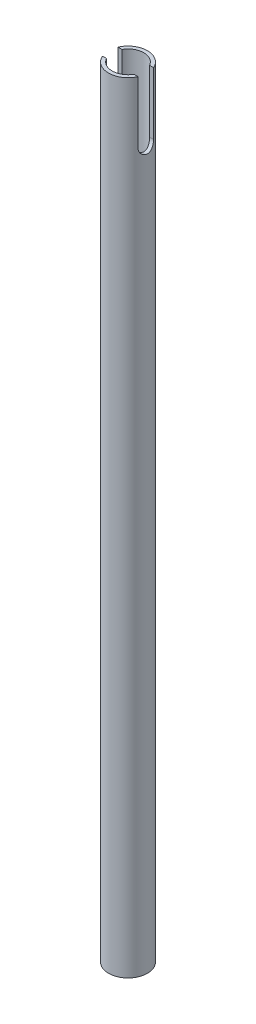
ISO-10303-21;
HEADER;
FILE_DESCRIPTION(('STEP AP214'),'2;1');
FILE_NAME('part.step','',(''),(''),'','','');
FILE_SCHEMA(('AUTOMOTIVE_DESIGN { 1 0 10303 214 1 1 1 1 }'));
ENDSEC;
DATA;
#1=APPLICATION_CONTEXT('core data for automotive mechanical design processes');
#2=APPLICATION_PROTOCOL_DEFINITION('international standard','automotive_design',2000,#1);
#3=PRODUCT_CONTEXT('',#1,'mechanical');
#4=PRODUCT('Part','Part','',(#3));
#5=PRODUCT_RELATED_PRODUCT_CATEGORY('part','',(#4));
#6=PRODUCT_DEFINITION_FORMATION('','',#4);
#7=PRODUCT_DEFINITION_CONTEXT('part definition',#1,'design');
#8=PRODUCT_DEFINITION('design','',#6,#7);
#9=PRODUCT_DEFINITION_SHAPE('','',#8);
#10=(LENGTH_UNIT() NAMED_UNIT(*) SI_UNIT(.MILLI.,.METRE.));
#11=(NAMED_UNIT(*) PLANE_ANGLE_UNIT() SI_UNIT($,.RADIAN.));
#12=(NAMED_UNIT(*) SI_UNIT($,.STERADIAN.) SOLID_ANGLE_UNIT());
#13=UNCERTAINTY_MEASURE_WITH_UNIT(LENGTH_MEASURE(1.E-05),#10,'distance_accuracy_value','');
#14=(GEOMETRIC_REPRESENTATION_CONTEXT(3) GLOBAL_UNCERTAINTY_ASSIGNED_CONTEXT((#13)) GLOBAL_UNIT_ASSIGNED_CONTEXT((#10,
#11,#12)) REPRESENTATION_CONTEXT('',''));
#15=CARTESIAN_POINT('',(0.,0.,0.));
#16=DIRECTION('',(0.,0.,1.));
#17=DIRECTION('',(1.,0.,0.));
#18=AXIS2_PLACEMENT_3D('',#15,#16,#17);
#19=CARTESIAN_POINT('',(0.,318.547702052848,3.17500000000002));
#20=DIRECTION('',(0.,1.,0.));
#21=DIRECTION('',(-1.,0.,0.));
#22=AXIS2_PLACEMENT_3D('',#19,#20,#21);
#23=PLANE('',#22);
#24=DIRECTION('',(-1.,0.,0.));
#25=VECTOR('',#24,1.);
#26=CARTESIAN_POINT('',(0.,318.547702052848,-3.17500000000001));
#27=LINE('',#26,#25);
#28=CARTESIAN_POINT('',(7.27483891574239,318.547702052848,-3.17500000000001));
#29=VERTEX_POINT('',#28);
#30=CARTESIAN_POINT('',(5.63085690548072,318.547702052848,-3.17500000000001));
#31=VERTEX_POINT('',#30);
#32=EDGE_CURVE('E178',#29,#31,#27,.T.);
#33=ORIENTED_EDGE('',*,*,#32,.F.);
#34=CARTESIAN_POINT('',(0.,318.547702052848,0.));
#35=DIRECTION('',(0.,1.,0.));
#36=DIRECTION('',(-1.,0.,0.));
#37=AXIS2_PLACEMENT_3D('',#34,#35,#36);
#38=CIRCLE('',#37,7.9375);
#39=CARTESIAN_POINT('',(-7.27483891574239,318.547702052848,-3.17500000000001));
#40=VERTEX_POINT('',#39);
#41=EDGE_CURVE('E219',#29,#40,#38,.T.);
#42=ORIENTED_EDGE('',*,*,#41,.T.);
#43=CARTESIAN_POINT('',(-5.63085690548072,318.547702052848,-3.17500000000001));
#44=VERTEX_POINT('',#43);
#45=EDGE_CURVE('E179',#44,#40,#27,.T.);
#46=ORIENTED_EDGE('',*,*,#45,.F.);
#47=CARTESIAN_POINT('',(0.,318.547702052848,0.));
#48=DIRECTION('',(0.,1.,0.));
#49=DIRECTION('',(-1.,0.,0.));
#50=AXIS2_PLACEMENT_3D('',#47,#48,#49);
#51=CIRCLE('',#50,6.4643);
#52=EDGE_CURVE('E215',#31,#44,#51,.T.);
#53=ORIENTED_EDGE('',*,*,#52,.F.);
#54=EDGE_LOOP('',(#33,#42,#46,#53));
#55=FACE_BOUND('',#54,.T.);
#56=ADVANCED_FACE('F44',(#55),#23,.T.);
#57=CARTESIAN_POINT('',(0.,366.39834235552,0.));
#58=DIRECTION('',(0.,-1.,0.));
#59=DIRECTION('',(0.,0.,-1.));
#60=AXIS2_PLACEMENT_3D('',#57,#58,#59);
#61=CYLINDRICAL_SURFACE('',#60,7.9375);
#62=CARTESIAN_POINT('',(0.,0.,0.));
#63=DIRECTION('',(0.,1.,0.));
#64=DIRECTION('',(0.,0.,1.));
#65=AXIS2_PLACEMENT_3D('',#62,#63,#64);
#66=CIRCLE('',#65,7.9375);
#67=CARTESIAN_POINT('',(0.,0.,7.9375));
#68=VERTEX_POINT('',#67);
#69=EDGE_CURVE('E216',#68,#68,#66,.T.);
#70=ORIENTED_EDGE('',*,*,#69,.T.);
#71=EDGE_LOOP('',(#70));
#72=FACE_BOUND('',#71,.T.);
#73=ORIENTED_EDGE('',*,*,#41,.F.);
#74=DIRECTION('',(0.,-1.,0.));
#75=VECTOR('',#74,1.);
#76=CARTESIAN_POINT('',(7.2748389157424,366.39834235552,-3.175));
#77=LINE('',#76,#75);
#78=CARTESIAN_POINT('',(7.27483891574239,293.147702052848,-3.17500000000001));
#79=VERTEX_POINT('',#78);
#80=EDGE_CURVE('E127',#29,#79,#77,.T.);
#81=ORIENTED_EDGE('',*,*,#80,.T.);
#82=CARTESIAN_POINT('',(7.27483891574239,293.147702052848,-3.17500000000001));
#83=CARTESIAN_POINT('',(7.2748213734673,293.062285262,-3.17501266882702));
#84=CARTESIAN_POINT('',(7.27634285897749,292.976878058775,-3.17155340043565));
#85=CARTESIAN_POINT('',(7.2823328035035,292.806752616868,-3.15779000732847));
#86=CARTESIAN_POINT('',(7.28680014012065,292.72203412822,-3.14748848956709));
#87=CARTESIAN_POINT('',(7.29852780386515,292.554220223623,-3.12019320836237));
#88=CARTESIAN_POINT('',(7.30577708764083,292.471119738178,-3.10322589952438));
#89=CARTESIAN_POINT('',(7.32282084608483,292.306802077751,-3.06278962927674));
#90=CARTESIAN_POINT('',(7.3326154761132,292.225585018058,-3.03932027099634));
#91=CARTESIAN_POINT('',(7.36535374856868,291.985753890049,-2.95952817722213));
#92=CARTESIAN_POINT('',(7.39167700537415,291.830625961629,-2.89376627017734));
#93=CARTESIAN_POINT('',(7.45033388590046,291.533539069465,-2.73920254152609));
#94=CARTESIAN_POINT('',(7.48267321509131,291.391592800016,-2.65037881684982));
#95=CARTESIAN_POINT('',(7.55175336550834,291.116872998133,-2.4468428923214));
#96=CARTESIAN_POINT('',(7.588634899463,290.984944096008,-2.33103600963009));
#97=CARTESIAN_POINT('',(7.66147804996073,290.741781870692,-2.07914313305181));
#98=CARTESIAN_POINT('',(7.69743947634238,290.630552796269,-1.94305298619927));
#99=CARTESIAN_POINT('',(7.76610424655586,290.427669402144,-1.64783437907488));
#100=CARTESIAN_POINT('',(7.79862271461643,290.336962168457,-1.4880080936519));
#101=CARTESIAN_POINT('',(7.85501261299655,290.184087087141,-1.15383332747061));
#102=CARTESIAN_POINT('',(7.87888765130921,290.121907328496,-0.979490943577491));
#103=CARTESIAN_POINT('',(7.91429574508624,290.03089789688,-0.630185812820631));
#104=CARTESIAN_POINT('',(7.92637039529115,290.000599272346,-0.455661798193253));
#105=CARTESIAN_POINT('',(7.93877492459936,289.969481836874,-0.103613634211554));
#106=CARTESIAN_POINT('',(7.93910896442721,289.968652582362,0.0739094300030662));
#107=CARTESIAN_POINT('',(7.92832361516669,289.995693574287,0.416295487790184));
#108=CARTESIAN_POINT('',(7.91784651916131,290.021954366317,0.581309494992125));
#109=CARTESIAN_POINT('',(7.88748217026596,290.099691566418,0.904358712556958));
#110=CARTESIAN_POINT('',(7.86759438481231,290.151169401561,1.06239352740443));
#111=CARTESIAN_POINT('',(7.81997467816328,290.278512369575,1.36984988491621));
#112=CARTESIAN_POINT('',(7.7921290207194,290.354733459711,1.51910565802053));
#113=CARTESIAN_POINT('',(7.7313568354174,290.529063849907,1.80309420082014));
#114=CARTESIAN_POINT('',(7.69842852631223,290.627180828913,1.93782185081832));
#115=CARTESIAN_POINT('',(7.62828318752464,290.85002762316,2.19831250886755));
#116=CARTESIAN_POINT('',(7.59092651959626,290.976080765635,2.32290812422053));
#117=CARTESIAN_POINT('',(7.51779639956165,291.247421664227,2.54968017957911));
#118=CARTESIAN_POINT('',(7.48202367463434,291.392718135143,2.6518464058569));
#119=CARTESIAN_POINT('',(7.41514238501918,291.703867074882,2.83359604410576));
#120=CARTESIAN_POINT('',(7.38419755733312,291.870190566346,2.91244544007289));
#121=CARTESIAN_POINT('',(7.34535742834899,292.128731439733,3.00845526999253));
#122=CARTESIAN_POINT('',(7.3336755200429,292.216398247957,3.03674359852996));
#123=CARTESIAN_POINT('',(7.31322917691504,292.394163962671,3.08565852812915));
#124=CARTESIAN_POINT('',(7.30446343423192,292.484261759241,3.10628856431505));
#125=CARTESIAN_POINT('',(7.28994070197193,292.669426211279,3.14023004946565));
#126=CARTESIAN_POINT('',(7.2843027635288,292.764555236803,3.15325280299648));
#127=CARTESIAN_POINT('',(7.27673901487912,292.955685811395,3.17064531592314));
#128=CARTESIAN_POINT('',(7.2748109173123,293.051686786135,3.17502040721544));
#129=CARTESIAN_POINT('',(7.2748389157424,293.147702052848,3.175));
#130=B_SPLINE_CURVE_WITH_KNOTS('',3,(#82,#83,#84,#85,#86,#87,#88,#89,#90,#91,#92,#93,#94,#95,
#96,#97,#98,#99,#100,#101,#102,#103,#104,#105,#106,#107,#108,#109,#110,#111,#112,#113,#114,#115,
#116,#117,#118,#119,#120,#121,#122,#123,#124,#125,#126,#127,#128,#129),.UNSPECIFIED.,.F.,.F.,(4,
2,2,2,2,2,2,2,2,2,2,2,2,2,2,2,2,2,2,2,2,2,2,4),(0.,0.256150829294331,0.512204118914609,
0.767251309112382,1.02231407025902,1.53143426526081,2.04103977971416,2.57679901192851,
3.11266809105968,3.66971038544651,4.22651988700747,4.75637028950526,5.28603291779513,
5.78594402974509,6.28588343572724,6.79335980872476,7.30101443548667,7.84196226045961,
8.38315590960401,8.93991483457334,9.2181569720588,9.49627415290112,9.78435582473147,
10.072259818324),.UNSPECIFIED.);
#131=CARTESIAN_POINT('',(7.27483891574239,293.147702052848,3.175));
#132=VERTEX_POINT('',#131);
#133=EDGE_CURVE('E126',#79,#132,#130,.T.);
#134=ORIENTED_EDGE('',*,*,#133,.T.);
#135=DIRECTION('',(0.,-1.,0.));
#136=VECTOR('',#135,1.);
#137=CARTESIAN_POINT('',(7.27483891574239,366.39834235552,3.17500000000001));
#138=LINE('',#137,#136);
#139=CARTESIAN_POINT('',(7.27483891574238,318.547702052848,3.17500000000003));
#140=VERTEX_POINT('',#139);
#141=EDGE_CURVE('E144',#132,#140,#138,.F.);
#142=ORIENTED_EDGE('',*,*,#141,.T.);
#143=CARTESIAN_POINT('',(-7.27483891574238,318.547702052848,3.17500000000003));
#144=VERTEX_POINT('',#143);
#145=EDGE_CURVE('E139',#144,#140,#38,.T.);
#146=ORIENTED_EDGE('',*,*,#145,.F.);
#147=DIRECTION('',(0.,-1.,0.));
#148=VECTOR('',#147,1.);
#149=CARTESIAN_POINT('',(-7.27483891574239,366.39834235552,3.17500000000001));
#150=LINE('',#149,#148);
#151=CARTESIAN_POINT('',(-7.27483891574239,293.147702052848,3.175));
#152=VERTEX_POINT('',#151);
#153=EDGE_CURVE('E66',#144,#152,#150,.T.);
#154=ORIENTED_EDGE('',*,*,#153,.T.);
#155=CARTESIAN_POINT('',(-7.2748389157424,293.147702052848,3.175));
#156=CARTESIAN_POINT('',(-7.2748213734673,293.062285262,3.17501266882701));
#157=CARTESIAN_POINT('',(-7.2763428589775,292.976878058775,3.17155340043565));
#158=CARTESIAN_POINT('',(-7.2823328035035,292.806752616868,3.15779000732847));
#159=CARTESIAN_POINT('',(-7.28680014012065,292.72203412822,3.14748848956708));
#160=CARTESIAN_POINT('',(-7.29852780386515,292.554220223623,3.12019320836236));
#161=CARTESIAN_POINT('',(-7.30577708764083,292.471119738178,3.10322589952438));
#162=CARTESIAN_POINT('',(-7.32282084608483,292.306802077751,3.06278962927674));
#163=CARTESIAN_POINT('',(-7.3326154761132,292.225585018058,3.03932027099634));
#164=CARTESIAN_POINT('',(-7.36535374856868,291.985753890049,2.95952817722212));
#165=CARTESIAN_POINT('',(-7.39167700537416,291.830625961629,2.89376627017733));
#166=CARTESIAN_POINT('',(-7.45033388590046,291.533539069465,2.73920254152609));
#167=CARTESIAN_POINT('',(-7.48267321509132,291.391592800016,2.65037881684981));
#168=CARTESIAN_POINT('',(-7.55175336550835,291.116872998133,2.44684289232139));
#169=CARTESIAN_POINT('',(-7.588634899463,290.984944096008,2.33103600963008));
#170=CARTESIAN_POINT('',(-7.66147804996073,290.741781870692,2.07914313305181));
#171=CARTESIAN_POINT('',(-7.69743947634239,290.630552796269,1.94305298619927));
#172=CARTESIAN_POINT('',(-7.76610424655587,290.427669402144,1.64783437907488));
#173=CARTESIAN_POINT('',(-7.79862271461643,290.336962168457,1.4880080936519));
#174=CARTESIAN_POINT('',(-7.85501261299655,290.184087087141,1.15383332747061));
#175=CARTESIAN_POINT('',(-7.87888765130921,290.121907328496,0.979490943577485));
#176=CARTESIAN_POINT('',(-7.91429574508624,290.03089789688,0.630185812820626));
#177=CARTESIAN_POINT('',(-7.92637039529115,290.000599272346,0.455661798193248));
#178=CARTESIAN_POINT('',(-7.93877492459936,289.969481836874,0.103613634211548));
#179=CARTESIAN_POINT('',(-7.93910896442721,289.968652582362,-0.0739094300030721));
#180=CARTESIAN_POINT('',(-7.92832361516669,289.995693574287,-0.41629548779019));
#181=CARTESIAN_POINT('',(-7.91784651916131,290.021954366317,-0.58130949499213));
#182=CARTESIAN_POINT('',(-7.88748217026596,290.099691566418,-0.904358712556966));
#183=CARTESIAN_POINT('',(-7.86759438481231,290.151169401561,-1.06239352740444));
#184=CARTESIAN_POINT('',(-7.81997467816327,290.278512369575,-1.36984988491622));
#185=CARTESIAN_POINT('',(-7.7921290207194,290.354733459711,-1.51910565802055));
#186=CARTESIAN_POINT('',(-7.73135683541739,290.529063849907,-1.80309420082014));
#187=CARTESIAN_POINT('',(-7.69842852631223,290.627180828913,-1.93782185081832));
#188=CARTESIAN_POINT('',(-7.62828318752464,290.85002762316,-2.19831250886755));
#189=CARTESIAN_POINT('',(-7.59092651959626,290.976080765635,-2.32290812422053));
#190=CARTESIAN_POINT('',(-7.51779639956165,291.247421664227,-2.54968017957911));
#191=CARTESIAN_POINT('',(-7.48202367463433,291.392718135143,-2.65184640585691));
#192=CARTESIAN_POINT('',(-7.41514238501918,291.703867074882,-2.83359604410578));
#193=CARTESIAN_POINT('',(-7.38419755733311,291.870190566346,-2.91244544007291));
#194=CARTESIAN_POINT('',(-7.34535742834898,292.128731439733,-3.00845526999255));
#195=CARTESIAN_POINT('',(-7.33367552004289,292.216398247957,-3.03674359852999));
#196=CARTESIAN_POINT('',(-7.31322917691504,292.394163962671,-3.08565852812916));
#197=CARTESIAN_POINT('',(-7.30446343423191,292.484261759241,-3.10628856431506));
#198=CARTESIAN_POINT('',(-7.28994070197192,292.669426211279,-3.14023004946565));
#199=CARTESIAN_POINT('',(-7.2843027635288,292.764555236803,-3.15325280299648));
#200=CARTESIAN_POINT('',(-7.27673901487912,292.955685811395,-3.17064531592315));
#201=CARTESIAN_POINT('',(-7.2748109173123,293.051686786135,-3.17502040721544));
#202=CARTESIAN_POINT('',(-7.27483891574239,293.147702052848,-3.17500000000001));
#203=B_SPLINE_CURVE_WITH_KNOTS('',3,(#155,#156,#157,#158,#159,#160,#161,#162,#163,#164,#165,
#166,#167,#168,#169,#170,#171,#172,#173,#174,#175,#176,#177,#178,#179,#180,#181,#182,#183,#184,
#185,#186,#187,#188,#189,#190,#191,#192,#193,#194,#195,#196,#197,#198,#199,#200,#201,#202),
.UNSPECIFIED.,.F.,.F.,(4,2,2,2,2,2,2,2,2,2,2,2,2,2,2,2,2,2,2,2,2,2,2,4),(0.,0.256150829294331,
0.512204118914609,0.767251309112382,1.02231407025902,1.53143426526081,2.04103977971416,
2.57679901192851,3.11266809105968,3.66971038544651,4.22651988700747,4.75637028950526,
5.28603291779513,5.78594402974509,6.28588343572724,6.7933598087248,7.30101443548665,
7.8419622604596,8.383155909604,8.93991483457339,9.21815697205885,9.49627415290111,
9.78435582473146,10.072259818324),.UNSPECIFIED.);
#204=CARTESIAN_POINT('',(-7.27483891574239,293.147702052848,-3.17500000000001));
#205=VERTEX_POINT('',#204);
#206=EDGE_CURVE('E117',#152,#205,#203,.T.);
#207=ORIENTED_EDGE('',*,*,#206,.T.);
#208=DIRECTION('',(0.,-1.,0.));
#209=VECTOR('',#208,1.);
#210=CARTESIAN_POINT('',(-7.2748389157424,366.39834235552,-3.175));
#211=LINE('',#210,#209);
#212=EDGE_CURVE('E142',#205,#40,#211,.F.);
#213=ORIENTED_EDGE('',*,*,#212,.T.);
#214=EDGE_LOOP('',(#73,#81,#134,#142,#146,#154,#207,#213));
#215=FACE_BOUND('',#214,.T.);
#216=ADVANCED_FACE('F46',(#72,#215),#61,.T.);
#217=CARTESIAN_POINT('',(0.,0.,0.));
#218=DIRECTION('',(0.,1.,0.));
#219=DIRECTION('',(0.,0.,1.));
#220=AXIS2_PLACEMENT_3D('',#217,#218,#219);
#221=PLANE('',#220);
#222=ORIENTED_EDGE('',*,*,#69,.F.);
#223=EDGE_LOOP('',(#222));
#224=FACE_BOUND('',#223,.T.);
#225=CARTESIAN_POINT('',(0.,0.,0.));
#226=DIRECTION('',(0.,1.,0.));
#227=DIRECTION('',(0.,0.,1.));
#228=AXIS2_PLACEMENT_3D('',#225,#226,#227);
#229=CIRCLE('',#228,6.4643);
#230=CARTESIAN_POINT('',(0.,0.,6.4643));
#231=VERTEX_POINT('',#230);
#232=EDGE_CURVE('E214',#231,#231,#229,.T.);
#233=ORIENTED_EDGE('',*,*,#232,.T.);
#234=EDGE_LOOP('',(#233));
#235=FACE_BOUND('',#234,.T.);
#236=ADVANCED_FACE('F185',(#224,#235),#221,.F.);
#237=CARTESIAN_POINT('',(0.,366.39834235552,0.));
#238=DIRECTION('',(0.,-1.,0.));
#239=DIRECTION('',(0.,0.,-1.));
#240=AXIS2_PLACEMENT_3D('',#237,#238,#239);
#241=CYLINDRICAL_SURFACE('',#240,6.4643);
#242=DIRECTION('',(0.,-1.,0.));
#243=VECTOR('',#242,1.);
#244=CARTESIAN_POINT('',(-5.63085690548073,366.39834235552,-3.175));
#245=LINE('',#244,#243);
#246=CARTESIAN_POINT('',(-5.63085690548072,293.147702052848,-3.17500000000001));
#247=VERTEX_POINT('',#246);
#248=EDGE_CURVE('E140',#247,#44,#245,.F.);
#249=ORIENTED_EDGE('',*,*,#248,.F.);
#250=CARTESIAN_POINT('',(-5.63085690548073,293.147702052848,3.175));
#251=CARTESIAN_POINT('',(-5.63083314427865,293.064328708216,3.17501475658537));
#252=CARTESIAN_POINT('',(-5.63270800290612,292.980968524125,3.17171650894932));
#253=CARTESIAN_POINT('',(-5.64007619078876,292.814970264005,3.15861005673362));
#254=CARTESIAN_POINT('',(-5.64556738634361,292.73233179127,3.14880569084843));
#255=CARTESIAN_POINT('',(-5.65994981136479,292.568828302249,3.12287502503968));
#256=CARTESIAN_POINT('',(-5.66882198481542,292.487955984627,3.10678414485081));
#257=CARTESIAN_POINT('',(-5.68964152520503,292.328091727843,3.06848950606601));
#258=CARTESIAN_POINT('',(-5.70158922758274,292.24909999482,3.04628508066559));
#259=CARTESIAN_POINT('',(-5.74141923049072,292.016035196588,2.97094683956398));
#260=CARTESIAN_POINT('',(-5.77333408209964,291.865395567206,2.9090108202004));
#261=CARTESIAN_POINT('',(-5.84425924105451,291.576540998147,2.76375069900003));
#262=CARTESIAN_POINT('',(-5.8832801090714,291.438345014753,2.68039468681891));
#263=CARTESIAN_POINT('',(-5.96775511660967,291.166404237279,2.48697633404428));
#264=CARTESIAN_POINT('',(-6.01347388807208,291.033867202745,2.37532770540396));
#265=CARTESIAN_POINT('',(-6.10404750316967,290.788492445533,2.13181920715592));
#266=CARTESIAN_POINT('',(-6.1489021156932,290.675659929335,1.99995401300493));
#267=CARTESIAN_POINT('',(-6.23617179606458,290.465726853052,1.70932187954953));
#268=CARTESIAN_POINT('',(-6.27824209999684,290.370113386051,1.5493674014036));
#269=CARTESIAN_POINT('',(-6.35176072116115,290.207706153993,1.21319061658815));
#270=CARTESIAN_POINT('',(-6.38321544776103,290.140894992183,1.03697820811137));
#271=CARTESIAN_POINT('',(-6.43004158193837,290.0427689468,0.686188092188344));
#272=CARTESIAN_POINT('',(-6.4463738522475,290.009320961884,0.512338218857009));
#273=CARTESIAN_POINT('',(-6.46469144763397,289.97186037337,0.160782019690509));
#274=CARTESIAN_POINT('',(-6.46668486855406,289.967831159652,-0.0169220731568674));
#275=CARTESIAN_POINT('',(-6.45656772214049,289.98846695754,-0.355165464690635));
#276=CARTESIAN_POINT('',(-6.44562758639317,290.010750568325,-0.515892945153658));
#277=CARTESIAN_POINT('',(-6.41262380355029,290.079137374664,-0.830980900255625));
#278=CARTESIAN_POINT('',(-6.39055953953696,290.125241891273,-0.985341021262247));
#279=CARTESIAN_POINT('',(-6.33694807701977,290.240301134301,-1.28605792480315));
#280=CARTESIAN_POINT('',(-6.30527071175889,290.309570935335,-1.4322699933214));
#281=CARTESIAN_POINT('',(-6.23531544865734,290.468578121139,-1.71135796541494));
#282=CARTESIAN_POINT('',(-6.19703506227319,290.558323226762,-1.84422881097801));
#283=CARTESIAN_POINT('',(-6.11334024943196,290.765239123846,-2.10589815284403));
#284=CARTESIAN_POINT('',(-6.06759349912714,290.884173160067,-2.23319819913492));
#285=CARTESIAN_POINT('',(-5.97642079952692,291.141326671501,-2.46684622430581));
#286=CARTESIAN_POINT('',(-5.93099515323758,291.27956232274,-2.57317644688654));
#287=CARTESIAN_POINT('',(-5.84266284464015,291.581765150258,-2.76814528378424));
#288=CARTESIAN_POINT('',(-5.80007313328349,291.746781169311,-2.85533090866606));
#289=CARTESIAN_POINT('',(-5.74498523796176,292.005157987756,-2.96377401450739));
#290=CARTESIAN_POINT('',(-5.72809486991883,292.093046475715,-2.99618869442097));
#291=CARTESIAN_POINT('',(-5.69788122082071,292.271883162299,-3.05325494421091));
#292=CARTESIAN_POINT('',(-5.68455638707004,292.362830009603,-3.07790989407047));
#293=CARTESIAN_POINT('',(-5.65951648210793,292.567947445588,-3.12376274190012));
#294=CARTESIAN_POINT('',(-5.64884707083826,292.682718410884,-3.14291763203008));
#295=CARTESIAN_POINT('',(-5.63809564796982,292.856271517395,-3.16213513069619));
#296=CARTESIAN_POINT('',(-5.63538722073202,292.914411390762,-3.16695519983112));
#297=CARTESIAN_POINT('',(-5.63176603795252,293.030929021994,-3.17338827752118));
#298=CARTESIAN_POINT('',(-5.63085344341391,293.089306800718,-3.17500099852574));
#299=CARTESIAN_POINT('',(-5.63085690548073,293.147702052848,-3.17500000000001));
#300=B_SPLINE_CURVE_WITH_KNOTS('',3,(#250,#251,#252,#253,#254,#255,#256,#257,#258,#259,#260,
#261,#262,#263,#264,#265,#266,#267,#268,#269,#270,#271,#272,#273,#274,#275,#276,#277,#278,#279,
#280,#281,#282,#283,#284,#285,#286,#287,#288,#289,#290,#291,#292,#293,#294,#295,#296,#297,#298,
#299),.UNSPECIFIED.,.F.,.F.,(4,2,2,2,2,2,2,2,2,2,2,2,2,2,2,2,2,2,2,2,2,2,2,2,4),(0.,
0.250012145988229,0.499876912554615,0.748353725112907,0.996857649784888,1.4924278441344,
1.98874063593385,2.52414179614751,3.05968421079767,3.6298216154268,4.19961416973237,
4.73004882970632,5.26018397799674,5.74579693142526,6.23143681875925,6.72397049630929,
7.21669020692482,7.75472587709904,8.2932151937208,8.86416763704415,9.14936329782655,
9.43443456060703,9.78397951274086,9.95908597830924,10.1342081421097),.UNSPECIFIED.);
#301=CARTESIAN_POINT('',(-5.63085690548072,293.147702052848,3.175));
#302=VERTEX_POINT('',#301);
#303=EDGE_CURVE('E12',#302,#247,#300,.T.);
#304=ORIENTED_EDGE('',*,*,#303,.F.);
#305=DIRECTION('',(0.,-1.,0.));
#306=VECTOR('',#305,1.);
#307=CARTESIAN_POINT('',(-5.63085690548072,366.39834235552,3.17500000000001));
#308=LINE('',#307,#306);
#309=CARTESIAN_POINT('',(-5.63085690548071,318.547702052848,3.17500000000003));
#310=VERTEX_POINT('',#309);
#311=EDGE_CURVE('E131',#310,#302,#308,.T.);
#312=ORIENTED_EDGE('',*,*,#311,.F.);
#313=CARTESIAN_POINT('',(5.63085690548071,318.547702052848,3.17500000000003));
#314=VERTEX_POINT('',#313);
#315=EDGE_CURVE('E210',#310,#314,#51,.T.);
#316=ORIENTED_EDGE('',*,*,#315,.T.);
#317=DIRECTION('',(0.,-1.,0.));
#318=VECTOR('',#317,1.);
#319=CARTESIAN_POINT('',(5.63085690548072,366.39834235552,3.17500000000001));
#320=LINE('',#319,#318);
#321=CARTESIAN_POINT('',(5.63085690548072,293.147702052848,3.175));
#322=VERTEX_POINT('',#321);
#323=EDGE_CURVE('E74',#322,#314,#320,.F.);
#324=ORIENTED_EDGE('',*,*,#323,.F.);
#325=CARTESIAN_POINT('',(5.63085690548072,293.147702052848,-3.17500000000001));
#326=CARTESIAN_POINT('',(5.63083314427865,293.064328708216,-3.17501475658538));
#327=CARTESIAN_POINT('',(5.63270800290612,292.980968524125,-3.17171650894933));
#328=CARTESIAN_POINT('',(5.64007619078876,292.814970264005,-3.15861005673363));
#329=CARTESIAN_POINT('',(5.64556738634361,292.73233179127,-3.14880569084843));
#330=CARTESIAN_POINT('',(5.65994981136478,292.568828302249,-3.12287502503968));
#331=CARTESIAN_POINT('',(5.66882198481542,292.487955984627,-3.10678414485082));
#332=CARTESIAN_POINT('',(5.68964152520503,292.328091727843,-3.06848950606602));
#333=CARTESIAN_POINT('',(5.70158922758274,292.24909999482,-3.0462850806656));
#334=CARTESIAN_POINT('',(5.74141923049072,292.016035196588,-2.97094683956399));
#335=CARTESIAN_POINT('',(5.77333408209964,291.865395567206,-2.90901082020041));
#336=CARTESIAN_POINT('',(5.84425924105451,291.576540998147,-2.76375069900004));
#337=CARTESIAN_POINT('',(5.8832801090714,291.438345014753,-2.68039468681891));
#338=CARTESIAN_POINT('',(5.96775511660967,291.166404237279,-2.48697633404429));
#339=CARTESIAN_POINT('',(6.01347388807208,291.033867202745,-2.37532770540397));
#340=CARTESIAN_POINT('',(6.10404750316967,290.788492445533,-2.13181920715593));
#341=CARTESIAN_POINT('',(6.1489021156932,290.675659929335,-1.99995401300494));
#342=CARTESIAN_POINT('',(6.23617179606458,290.465726853052,-1.70932187954953));
#343=CARTESIAN_POINT('',(6.27824209999684,290.370113386051,-1.54936740140361));
#344=CARTESIAN_POINT('',(6.35176072116115,290.207706153993,-1.21319061658815));
#345=CARTESIAN_POINT('',(6.38321544776103,290.140894992183,-1.03697820811138));
#346=CARTESIAN_POINT('',(6.43004158193837,290.0427689468,-0.686188092188346));
#347=CARTESIAN_POINT('',(6.4463738522475,290.009320961884,-0.512338218857007));
#348=CARTESIAN_POINT('',(6.46469144763397,289.97186037337,-0.160782019690508));
#349=CARTESIAN_POINT('',(6.46668486855406,289.967831159652,0.0169220731568652));
#350=CARTESIAN_POINT('',(6.45656772214049,289.98846695754,0.355165464690629));
#351=CARTESIAN_POINT('',(6.44562758639317,290.010750568325,0.515892945153652));
#352=CARTESIAN_POINT('',(6.41262380355029,290.079137374664,0.830980900255619));
#353=CARTESIAN_POINT('',(6.39055953953696,290.125241891273,0.985341021262241));
#354=CARTESIAN_POINT('',(6.33694807701977,290.240301134301,1.28605792480314));
#355=CARTESIAN_POINT('',(6.30527071175889,290.309570935335,1.43226999332139));
#356=CARTESIAN_POINT('',(6.23531544865734,290.468578121139,1.71135796541493));
#357=CARTESIAN_POINT('',(6.19703506227319,290.558323226762,1.844228810978));
#358=CARTESIAN_POINT('',(6.11334024943196,290.765239123846,2.10589815284403));
#359=CARTESIAN_POINT('',(6.06759349912714,290.884173160067,2.23319819913492));
#360=CARTESIAN_POINT('',(5.97642079952693,291.141326671501,2.46684622430581));
#361=CARTESIAN_POINT('',(5.93099515323759,291.27956232274,2.57317644688653));
#362=CARTESIAN_POINT('',(5.84266284464016,291.581765150258,2.76814528378423));
#363=CARTESIAN_POINT('',(5.80007313328349,291.746781169311,2.85533090866605));
#364=CARTESIAN_POINT('',(5.74498523796176,292.005157987756,2.96377401450739));
#365=CARTESIAN_POINT('',(5.72809486991883,292.093046475715,2.99618869442096));
#366=CARTESIAN_POINT('',(5.69788122082071,292.271883162299,3.0532549442109));
#367=CARTESIAN_POINT('',(5.68455638707004,292.362830009603,3.07790989407046));
#368=CARTESIAN_POINT('',(5.65951648210793,292.567947445588,3.12376274190011));
#369=CARTESIAN_POINT('',(5.64884707083827,292.682718410884,3.14291763203007));
#370=CARTESIAN_POINT('',(5.63809564796983,292.856271517395,3.16213513069618));
#371=CARTESIAN_POINT('',(5.63538722073203,292.914411390762,3.16695519983111));
#372=CARTESIAN_POINT('',(5.63176603795252,293.030929021994,3.17338827752118));
#373=CARTESIAN_POINT('',(5.63085344341391,293.089306800718,3.17500099852574));
#374=CARTESIAN_POINT('',(5.63085690548073,293.147702052848,3.175));
#375=B_SPLINE_CURVE_WITH_KNOTS('',3,(#325,#326,#327,#328,#329,#330,#331,#332,#333,#334,#335,
#336,#337,#338,#339,#340,#341,#342,#343,#344,#345,#346,#347,#348,#349,#350,#351,#352,#353,#354,
#355,#356,#357,#358,#359,#360,#361,#362,#363,#364,#365,#366,#367,#368,#369,#370,#371,#372,#373,
#374),.UNSPECIFIED.,.F.,.F.,(4,2,2,2,2,2,2,2,2,2,2,2,2,2,2,2,2,2,2,2,2,2,2,2,4),(0.,
0.250012145988229,0.499876912554615,0.748353725112907,0.996857649784888,1.4924278441344,
1.98874063593385,2.52414179614751,3.05968421079767,3.6298216154268,4.19961416973237,
4.73004882970633,5.26018397799674,5.74579693142526,6.23143681875925,6.72397049630929,
7.21669020692482,7.75472587709904,8.2932151937208,8.86416763704415,9.14936329782655,
9.43443456060703,9.78397951274086,9.95908597830924,10.1342081421097),.UNSPECIFIED.);
#376=CARTESIAN_POINT('',(5.63085690548072,293.147702052848,-3.17500000000001));
#377=VERTEX_POINT('',#376);
#378=EDGE_CURVE('E59',#377,#322,#375,.T.);
#379=ORIENTED_EDGE('',*,*,#378,.F.);
#380=DIRECTION('',(0.,-1.,0.));
#381=VECTOR('',#380,1.);
#382=CARTESIAN_POINT('',(5.63085690548073,366.39834235552,-3.175));
#383=LINE('',#382,#381);
#384=EDGE_CURVE('E149',#31,#377,#383,.T.);
#385=ORIENTED_EDGE('',*,*,#384,.F.);
#386=ORIENTED_EDGE('',*,*,#52,.T.);
#387=EDGE_LOOP('',(#249,#304,#312,#316,#324,#379,#385,#386));
#388=FACE_BOUND('',#387,.T.);
#389=ORIENTED_EDGE('',*,*,#232,.F.);
#390=EDGE_LOOP('',(#389));
#391=FACE_BOUND('',#390,.T.);
#392=ADVANCED_FACE('F181',(#388,#391),#241,.F.);
#393=DIRECTION('',(1.,0.,0.));
#394=VECTOR('',#393,1.);
#395=CARTESIAN_POINT('',(0.,318.547702052848,3.17500000000002));
#396=LINE('',#395,#394);
#397=EDGE_CURVE('E208',#144,#310,#396,.T.);
#398=ORIENTED_EDGE('',*,*,#397,.F.);
#399=ORIENTED_EDGE('',*,*,#145,.T.);
#400=EDGE_CURVE('E211',#314,#140,#396,.T.);
#401=ORIENTED_EDGE('',*,*,#400,.F.);
#402=ORIENTED_EDGE('',*,*,#315,.F.);
#403=EDGE_LOOP('',(#398,#399,#401,#402));
#404=FACE_BOUND('',#403,.T.);
#405=ADVANCED_FACE('F184',(#404),#23,.T.);
#406=CARTESIAN_POINT('',(-7.9375,343.947702052848,3.17500000000001));
#407=DIRECTION('',(0.,0.,1.));
#408=DIRECTION('',(0.,-1.,0.));
#409=AXIS2_PLACEMENT_3D('',#406,#407,#408);
#410=PLANE('',#409);
#411=DIRECTION('',(1.,0.,0.));
#412=VECTOR('',#411,1.);
#413=CARTESIAN_POINT('',(-7.9375,293.147702052848,3.175));
#414=LINE('',#413,#412);
#415=EDGE_CURVE('E133',#322,#132,#414,.T.);
#416=ORIENTED_EDGE('',*,*,#415,.F.);
#417=ORIENTED_EDGE('',*,*,#323,.T.);
#418=ORIENTED_EDGE('',*,*,#400,.T.);
#419=ORIENTED_EDGE('',*,*,#141,.F.);
#420=EDGE_LOOP('',(#416,#417,#418,#419));
#421=FACE_BOUND('',#420,.T.);
#422=ADVANCED_FACE('F202',(#421),#410,.F.);
#423=CARTESIAN_POINT('',(-7.9375,343.947702052848,-3.175));
#424=DIRECTION('',(0.,0.,-1.));
#425=DIRECTION('',(0.,1.,0.));
#426=AXIS2_PLACEMENT_3D('',#423,#424,#425);
#427=PLANE('',#426);
#428=ORIENTED_EDGE('',*,*,#32,.T.);
#429=ORIENTED_EDGE('',*,*,#384,.T.);
#430=DIRECTION('',(1.,0.,0.));
#431=VECTOR('',#430,1.);
#432=CARTESIAN_POINT('',(-7.9375,293.147702052848,-3.17500000000001));
#433=LINE('',#432,#431);
#434=EDGE_CURVE('E132',#377,#79,#433,.T.);
#435=ORIENTED_EDGE('',*,*,#434,.T.);
#436=ORIENTED_EDGE('',*,*,#80,.F.);
#437=EDGE_LOOP('',(#428,#429,#435,#436));
#438=FACE_BOUND('',#437,.T.);
#439=ADVANCED_FACE('F167',(#438),#427,.F.);
#440=CARTESIAN_POINT('',(-7.9375,293.147702052848,0.));
#441=DIRECTION('',(1.,0.,0.));
#442=DIRECTION('',(0.,0.,-1.));
#443=AXIS2_PLACEMENT_3D('',#440,#441,#442);
#444=CYLINDRICAL_SURFACE('',#443,3.175);
#445=ORIENTED_EDGE('',*,*,#434,.F.);
#446=ORIENTED_EDGE('',*,*,#378,.T.);
#447=ORIENTED_EDGE('',*,*,#415,.T.);
#448=ORIENTED_EDGE('',*,*,#133,.F.);
#449=EDGE_LOOP('',(#445,#446,#447,#448));
#450=FACE_BOUND('',#449,.T.);
#451=ADVANCED_FACE('F162',(#450),#444,.F.);
#452=EDGE_CURVE('E119',#152,#302,#414,.T.);
#453=ORIENTED_EDGE('',*,*,#452,.T.);
#454=ORIENTED_EDGE('',*,*,#303,.T.);
#455=EDGE_CURVE('E122',#205,#247,#433,.T.);
#456=ORIENTED_EDGE('',*,*,#455,.F.);
#457=ORIENTED_EDGE('',*,*,#206,.F.);
#458=EDGE_LOOP('',(#453,#454,#456,#457));
#459=FACE_BOUND('',#458,.T.);
#460=ADVANCED_FACE('F118',(#459),#444,.F.);
#461=ORIENTED_EDGE('',*,*,#455,.T.);
#462=ORIENTED_EDGE('',*,*,#248,.T.);
#463=ORIENTED_EDGE('',*,*,#45,.T.);
#464=ORIENTED_EDGE('',*,*,#212,.F.);
#465=EDGE_LOOP('',(#461,#462,#463,#464));
#466=FACE_BOUND('',#465,.T.);
#467=ADVANCED_FACE('F226',(#466),#427,.F.);
#468=ORIENTED_EDGE('',*,*,#397,.T.);
#469=ORIENTED_EDGE('',*,*,#311,.T.);
#470=ORIENTED_EDGE('',*,*,#452,.F.);
#471=ORIENTED_EDGE('',*,*,#153,.F.);
#472=EDGE_LOOP('',(#468,#469,#470,#471));
#473=FACE_BOUND('',#472,.T.);
#474=ADVANCED_FACE('F129',(#473),#410,.F.);
#475=CLOSED_SHELL('',(#56,#216,#236,#392,#405,#422,#439,#451,#460,#467,#474));
#476=MANIFOLD_SOLID_BREP('B2',#475);
#477=ADVANCED_BREP_SHAPE_REPRESENTATION('',(#18,#476),#14);
#478=SHAPE_DEFINITION_REPRESENTATION(#9,#477);
ENDSEC;
END-ISO-10303-21;
